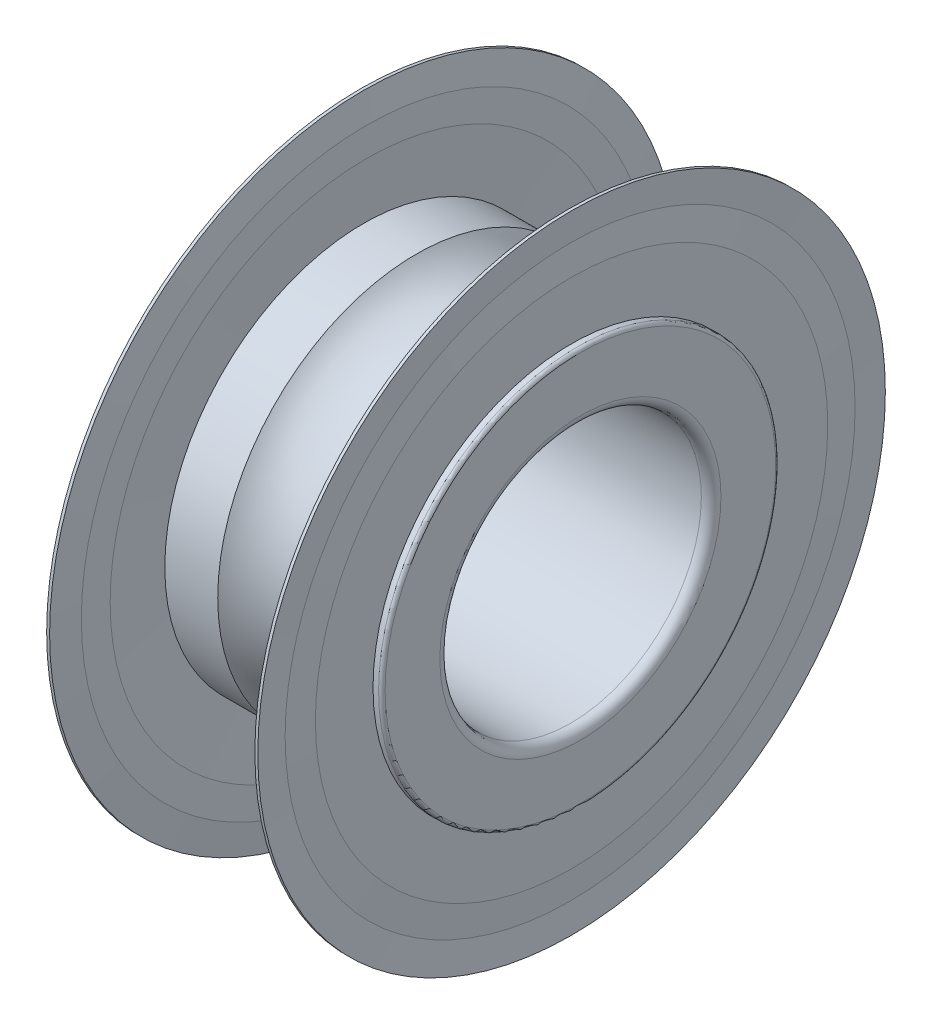
ISO-10303-21;
HEADER;
FILE_DESCRIPTION(('STEP AP214'),'2;1');
FILE_NAME('part.step','',(''),(''),'','','');
FILE_SCHEMA(('AUTOMOTIVE_DESIGN { 1 0 10303 214 1 1 1 1 }'));
ENDSEC;
DATA;
#1=APPLICATION_CONTEXT('core data for automotive mechanical design processes');
#2=APPLICATION_PROTOCOL_DEFINITION('international standard','automotive_design',2000,#1);
#3=PRODUCT_CONTEXT('',#1,'mechanical');
#4=PRODUCT('Part','Part','',(#3));
#5=PRODUCT_RELATED_PRODUCT_CATEGORY('part','',(#4));
#6=PRODUCT_DEFINITION_FORMATION('','',#4);
#7=PRODUCT_DEFINITION_CONTEXT('part definition',#1,'design');
#8=PRODUCT_DEFINITION('design','',#6,#7);
#9=PRODUCT_DEFINITION_SHAPE('','',#8);
#10=(LENGTH_UNIT() NAMED_UNIT(*) SI_UNIT(.MILLI.,.METRE.));
#11=(NAMED_UNIT(*) PLANE_ANGLE_UNIT() SI_UNIT($,.RADIAN.));
#12=(NAMED_UNIT(*) SI_UNIT($,.STERADIAN.) SOLID_ANGLE_UNIT());
#13=UNCERTAINTY_MEASURE_WITH_UNIT(LENGTH_MEASURE(1.E-05),#10,'distance_accuracy_value','');
#14=(GEOMETRIC_REPRESENTATION_CONTEXT(3) GLOBAL_UNCERTAINTY_ASSIGNED_CONTEXT((#13)) GLOBAL_UNIT_ASSIGNED_CONTEXT((#10,
#11,#12)) REPRESENTATION_CONTEXT('',''));
#15=CARTESIAN_POINT('',(0.,0.,0.));
#16=DIRECTION('',(0.,0.,1.));
#17=DIRECTION('',(1.,0.,0.));
#18=AXIS2_PLACEMENT_3D('',#15,#16,#17);
#19=CARTESIAN_POINT('',(0.,-6.13826064701138,-5.975));
#20=DIRECTION('',(-1.,0.,0.));
#21=DIRECTION('',(0.,0.,1.));
#22=AXIS2_PLACEMENT_3D('',#19,#20,#21);
#23=PLANE('',#22);
#24=CARTESIAN_POINT('',(0.,0.,0.));
#25=DIRECTION('',(-1.,0.,0.));
#26=DIRECTION('',(0.,0.,-1.));
#27=AXIS2_PLACEMENT_3D('',#24,#25,#26);
#28=CIRCLE('',#27,5.97500000788503);
#29=CARTESIAN_POINT('',(0.,0.,-5.97500000788503));
#30=VERTEX_POINT('',#29);
#31=EDGE_CURVE('E98',#30,#30,#28,.F.);
#32=ORIENTED_EDGE('',*,*,#31,.F.);
#33=EDGE_LOOP('',(#32));
#34=FACE_BOUND('',#33,.T.);
#35=CARTESIAN_POINT('',(0.,0.,0.));
#36=DIRECTION('',(1.,0.,0.));
#37=DIRECTION('',(0.,0.,1.));
#38=AXIS2_PLACEMENT_3D('',#35,#36,#37);
#39=CIRCLE('',#38,4.29999999999994);
#40=CARTESIAN_POINT('',(0.,0.,4.29999999999994));
#41=VERTEX_POINT('',#40);
#42=EDGE_CURVE('E95',#41,#41,#39,.T.);
#43=ORIENTED_EDGE('',*,*,#42,.T.);
#44=EDGE_LOOP('',(#43));
#45=FACE_BOUND('',#44,.T.);
#46=ADVANCED_FACE('F15',(#34,#45),#23,.T.);
#47=CARTESIAN_POINT('',(7.,-6.13826064701138,5.975));
#48=DIRECTION('',(1.,0.,0.));
#49=DIRECTION('',(0.,0.,-1.));
#50=AXIS2_PLACEMENT_3D('',#47,#48,#49);
#51=PLANE('',#50);
#52=CARTESIAN_POINT('',(7.,0.,0.));
#53=DIRECTION('',(1.,0.,0.));
#54=DIRECTION('',(0.,0.,1.));
#55=AXIS2_PLACEMENT_3D('',#52,#53,#54);
#56=CIRCLE('',#55,5.97500003233946);
#57=CARTESIAN_POINT('',(7.,0.,5.97500003233946));
#58=VERTEX_POINT('',#57);
#59=EDGE_CURVE('E92',#58,#58,#56,.T.);
#60=ORIENTED_EDGE('',*,*,#59,.T.);
#61=EDGE_LOOP('',(#60));
#62=FACE_BOUND('',#61,.T.);
#63=CARTESIAN_POINT('',(7.,0.,0.));
#64=DIRECTION('',(-1.,0.,0.));
#65=DIRECTION('',(0.,0.,-1.));
#66=AXIS2_PLACEMENT_3D('',#63,#64,#65);
#67=CIRCLE('',#66,4.3);
#68=CARTESIAN_POINT('',(7.,0.,-4.3));
#69=VERTEX_POINT('',#68);
#70=EDGE_CURVE('E89',#69,#69,#67,.F.);
#71=ORIENTED_EDGE('',*,*,#70,.F.);
#72=EDGE_LOOP('',(#71));
#73=FACE_BOUND('',#72,.T.);
#74=ADVANCED_FACE('F107',(#62,#73),#51,.T.);
#75=CARTESIAN_POINT('',(0.27,-8.0516515181509,-7.8375));
#76=DIRECTION('',(-1.,0.,0.));
#77=DIRECTION('',(0.,0.,1.));
#78=AXIS2_PLACEMENT_3D('',#75,#76,#77);
#79=PLANE('',#78);
#80=CARTESIAN_POINT('',(0.27,0.,0.));
#81=DIRECTION('',(-1.,0.,0.));
#82=DIRECTION('',(0.,0.,-1.));
#83=AXIS2_PLACEMENT_3D('',#80,#81,#82);
#84=CIRCLE('',#83,7.83750000000007);
#85=CARTESIAN_POINT('',(0.27,0.,-7.83750000000007));
#86=VERTEX_POINT('',#85);
#87=EDGE_CURVE('E86',#86,#86,#84,.F.);
#88=ORIENTED_EDGE('',*,*,#87,.F.);
#89=EDGE_LOOP('',(#88));
#90=FACE_BOUND('',#89,.T.);
#91=CARTESIAN_POINT('',(0.27,0.,0.));
#92=DIRECTION('',(1.,0.,0.));
#93=DIRECTION('',(0.,0.,1.));
#94=AXIS2_PLACEMENT_3D('',#91,#92,#93);
#95=CIRCLE('',#94,6.075);
#96=CARTESIAN_POINT('',(0.27,0.,6.075));
#97=VERTEX_POINT('',#96);
#98=EDGE_CURVE('E83',#97,#97,#95,.T.);
#99=ORIENTED_EDGE('',*,*,#98,.T.);
#100=EDGE_LOOP('',(#99));
#101=FACE_BOUND('',#100,.T.);
#102=ADVANCED_FACE('F204',(#90,#101),#79,.T.);
#103=CARTESIAN_POINT('',(0.45,-8.95698075583773,8.71875));
#104=DIRECTION('',(1.,0.,0.));
#105=DIRECTION('',(0.,0.,-1.));
#106=AXIS2_PLACEMENT_3D('',#103,#104,#105);
#107=PLANE('',#106);
#108=CARTESIAN_POINT('',(0.45,0.,0.));
#109=DIRECTION('',(1.,0.,0.));
#110=DIRECTION('',(0.,0.,1.));
#111=AXIS2_PLACEMENT_3D('',#108,#109,#110);
#112=CIRCLE('',#111,8.71875);
#113=CARTESIAN_POINT('',(0.45,0.,8.71875));
#114=VERTEX_POINT('',#113);
#115=EDGE_CURVE('E80',#114,#114,#112,.T.);
#116=ORIENTED_EDGE('',*,*,#115,.T.);
#117=EDGE_LOOP('',(#116));
#118=FACE_BOUND('',#117,.T.);
#119=CARTESIAN_POINT('',(0.45,0.,0.));
#120=DIRECTION('',(-1.,0.,0.));
#121=DIRECTION('',(0.,0.,-1.));
#122=AXIS2_PLACEMENT_3D('',#119,#120,#121);
#123=CIRCLE('',#122,7.8375);
#124=CARTESIAN_POINT('',(0.45,0.,-7.8375));
#125=VERTEX_POINT('',#124);
#126=EDGE_CURVE('E77',#125,#125,#123,.F.);
#127=ORIENTED_EDGE('',*,*,#126,.F.);
#128=EDGE_LOOP('',(#127));
#129=FACE_BOUND('',#128,.T.);
#130=ADVANCED_FACE('F193',(#118,#129),#107,.T.);
#131=CARTESIAN_POINT('',(6.55,-8.95698075583773,-8.71875));
#132=DIRECTION('',(-1.,0.,0.));
#133=DIRECTION('',(0.,0.,1.));
#134=AXIS2_PLACEMENT_3D('',#131,#132,#133);
#135=PLANE('',#134);
#136=CARTESIAN_POINT('',(6.55,0.,0.));
#137=DIRECTION('',(-1.,0.,0.));
#138=DIRECTION('',(0.,0.,-1.));
#139=AXIS2_PLACEMENT_3D('',#136,#137,#138);
#140=CIRCLE('',#139,8.71875000000001);
#141=CARTESIAN_POINT('',(6.55,0.,-8.71875000000001));
#142=VERTEX_POINT('',#141);
#143=EDGE_CURVE('E74',#142,#142,#140,.F.);
#144=ORIENTED_EDGE('',*,*,#143,.F.);
#145=EDGE_LOOP('',(#144));
#146=FACE_BOUND('',#145,.T.);
#147=CARTESIAN_POINT('',(6.55,0.,0.));
#148=DIRECTION('',(1.,0.,0.));
#149=DIRECTION('',(0.,-1.16849693486611E-09,1.));
#150=AXIS2_PLACEMENT_3D('',#147,#148,#149);
#151=CIRCLE('',#150,7.8375);
#152=CARTESIAN_POINT('',(6.55,-9.15809472701313E-09,7.8375));
#153=VERTEX_POINT('',#152);
#154=EDGE_CURVE('E71',#153,#153,#151,.T.);
#155=ORIENTED_EDGE('',*,*,#154,.T.);
#156=EDGE_LOOP('',(#155));
#157=FACE_BOUND('',#156,.T.);
#158=ADVANCED_FACE('F189',(#146,#157),#135,.T.);
#159=CARTESIAN_POINT('',(6.73,-8.05165150478405,7.8375));
#160=DIRECTION('',(1.,0.,0.));
#161=DIRECTION('',(0.,0.,-1.));
#162=AXIS2_PLACEMENT_3D('',#159,#160,#161);
#163=PLANE('',#162);
#164=CARTESIAN_POINT('',(6.73,0.,0.));
#165=DIRECTION('',(1.,0.,0.));
#166=DIRECTION('',(0.,-1.16849670821771E-09,1.));
#167=AXIS2_PLACEMENT_3D('',#164,#165,#166);
#168=CIRCLE('',#167,7.8375);
#169=CARTESIAN_POINT('',(6.73,-9.15809295065628E-09,7.8375));
#170=VERTEX_POINT('',#169);
#171=EDGE_CURVE('E68',#170,#170,#168,.T.);
#172=ORIENTED_EDGE('',*,*,#171,.T.);
#173=EDGE_LOOP('',(#172));
#174=FACE_BOUND('',#173,.T.);
#175=CARTESIAN_POINT('',(6.73,0.,0.));
#176=DIRECTION('',(-1.,0.,0.));
#177=DIRECTION('',(0.,0.,-1.));
#178=AXIS2_PLACEMENT_3D('',#175,#176,#177);
#179=CIRCLE('',#178,6.075);
#180=CARTESIAN_POINT('',(6.73,0.,-6.075));
#181=VERTEX_POINT('',#180);
#182=EDGE_CURVE('E65',#181,#181,#179,.F.);
#183=ORIENTED_EDGE('',*,*,#182,.F.);
#184=EDGE_LOOP('',(#183));
#185=FACE_BOUND('',#184,.T.);
#186=ADVANCED_FACE('F192',(#174,#185),#163,.T.);
#187=CARTESIAN_POINT('',(50.,0.,0.));
#188=DIRECTION('',(1.,0.,0.));
#189=DIRECTION('',(0.,0.,1.));
#190=AXIS2_PLACEMENT_3D('',#187,#188,#189);
#191=CYLINDRICAL_SURFACE('',#190,6.075);
#192=CARTESIAN_POINT('',(5.020728526069,0.,0.));
#193=DIRECTION('',(1.,0.,0.));
#194=DIRECTION('',(0.,0.,1.));
#195=AXIS2_PLACEMENT_3D('',#192,#193,#194);
#196=CIRCLE('',#195,6.075);
#197=CARTESIAN_POINT('',(5.020728526069,0.,6.075));
#198=VERTEX_POINT('',#197);
#199=EDGE_CURVE('E62',#198,#198,#196,.T.);
#200=ORIENTED_EDGE('',*,*,#199,.T.);
#201=EDGE_LOOP('',(#200));
#202=FACE_BOUND('',#201,.T.);
#203=CARTESIAN_POINT('',(6.64,0.,0.));
#204=DIRECTION('',(-1.,0.,0.));
#205=DIRECTION('',(0.,0.,-1.));
#206=AXIS2_PLACEMENT_3D('',#203,#204,#205);
#207=CIRCLE('',#206,6.075);
#208=CARTESIAN_POINT('',(6.64,0.,-6.075));
#209=VERTEX_POINT('',#208);
#210=EDGE_CURVE('E59',#209,#209,#207,.F.);
#211=ORIENTED_EDGE('',*,*,#210,.F.);
#212=EDGE_LOOP('',(#211));
#213=FACE_BOUND('',#212,.T.);
#214=ADVANCED_FACE('F201',(#202,#213),#191,.T.);
#215=CARTESIAN_POINT('',(50.,0.,0.));
#216=DIRECTION('',(1.,0.,0.));
#217=DIRECTION('',(0.,0.,1.));
#218=AXIS2_PLACEMENT_3D('',#215,#216,#217);
#219=CYLINDRICAL_SURFACE('',#218,6.075);
#220=CARTESIAN_POINT('',(0.100000000000001,0.,0.));
#221=DIRECTION('',(1.,0.,0.));
#222=DIRECTION('',(0.,0.,1.));
#223=AXIS2_PLACEMENT_3D('',#220,#221,#222);
#224=CIRCLE('',#223,6.075);
#225=CARTESIAN_POINT('',(0.100000000000001,0.,6.075));
#226=VERTEX_POINT('',#225);
#227=EDGE_CURVE('E56',#226,#226,#224,.T.);
#228=ORIENTED_EDGE('',*,*,#227,.T.);
#229=EDGE_LOOP('',(#228));
#230=FACE_BOUND('',#229,.T.);
#231=ORIENTED_EDGE('',*,*,#98,.F.);
#232=EDGE_LOOP('',(#231));
#233=FACE_BOUND('',#232,.T.);
#234=ADVANCED_FACE('F124',(#230,#233),#219,.T.);
#235=CARTESIAN_POINT('',(0.0999999999999228,0.,0.));
#236=DIRECTION('',(1.,0.,0.));
#237=DIRECTION('',(0.,0.,1.));
#238=AXIS2_PLACEMENT_3D('',#235,#236,#237);
#239=TOROIDAL_SURFACE('',#238,5.97500000000008,0.0999999999999231);
#240=ORIENTED_EDGE('',*,*,#31,.T.);
#241=EDGE_LOOP('',(#240));
#242=FACE_BOUND('',#241,.T.);
#243=ORIENTED_EDGE('',*,*,#227,.F.);
#244=EDGE_LOOP('',(#243));
#245=FACE_BOUND('',#244,.T.);
#246=ADVANCED_FACE('F102',(#242,#245),#239,.T.);
#247=CARTESIAN_POINT('',(0.299999999999938,0.,0.));
#248=DIRECTION('',(1.,0.,0.));
#249=DIRECTION('',(0.,0.,1.));
#250=AXIS2_PLACEMENT_3D('',#247,#248,#249);
#251=TOROIDAL_SURFACE('',#250,4.29999999999994,0.299999999999938);
#252=CARTESIAN_POINT('',(0.3,0.,0.));
#253=DIRECTION('',(1.,0.,0.));
#254=DIRECTION('',(0.,0.,1.));
#255=AXIS2_PLACEMENT_3D('',#252,#253,#254);
#256=CIRCLE('',#255,4.);
#257=CARTESIAN_POINT('',(0.3,0.,4.));
#258=VERTEX_POINT('',#257);
#259=EDGE_CURVE('E53',#258,#258,#256,.T.);
#260=ORIENTED_EDGE('',*,*,#259,.T.);
#261=EDGE_LOOP('',(#260));
#262=FACE_BOUND('',#261,.T.);
#263=ORIENTED_EDGE('',*,*,#42,.F.);
#264=EDGE_LOOP('',(#263));
#265=FACE_BOUND('',#264,.T.);
#266=ADVANCED_FACE('F111',(#262,#265),#251,.T.);
#267=CARTESIAN_POINT('',(50.,0.,0.));
#268=DIRECTION('',(1.,0.,0.));
#269=DIRECTION('',(0.,0.,1.));
#270=AXIS2_PLACEMENT_3D('',#267,#268,#269);
#271=CYLINDRICAL_SURFACE('',#270,4.);
#272=CARTESIAN_POINT('',(6.7,0.,0.));
#273=DIRECTION('',(1.,0.,0.));
#274=DIRECTION('',(0.,0.,1.));
#275=AXIS2_PLACEMENT_3D('',#272,#273,#274);
#276=CIRCLE('',#275,4.);
#277=CARTESIAN_POINT('',(6.7,0.,4.));
#278=VERTEX_POINT('',#277);
#279=EDGE_CURVE('E50',#278,#278,#276,.T.);
#280=ORIENTED_EDGE('',*,*,#279,.T.);
#281=EDGE_LOOP('',(#280));
#282=FACE_BOUND('',#281,.T.);
#283=ORIENTED_EDGE('',*,*,#259,.F.);
#284=EDGE_LOOP('',(#283));
#285=FACE_BOUND('',#284,.T.);
#286=ADVANCED_FACE('F113',(#282,#285),#271,.F.);
#287=CARTESIAN_POINT('',(6.70000000000012,0.,0.));
#288=DIRECTION('',(1.,0.,0.));
#289=DIRECTION('',(0.,0.,1.));
#290=AXIS2_PLACEMENT_3D('',#287,#288,#289);
#291=TOROIDAL_SURFACE('',#290,4.29999999999988,0.299999999999877);
#292=ORIENTED_EDGE('',*,*,#70,.T.);
#293=EDGE_LOOP('',(#292));
#294=FACE_BOUND('',#293,.T.);
#295=ORIENTED_EDGE('',*,*,#279,.F.);
#296=EDGE_LOOP('',(#295));
#297=FACE_BOUND('',#296,.T.);
#298=ADVANCED_FACE('F121',(#294,#297),#291,.T.);
#299=CARTESIAN_POINT('',(6.90000000000016,0.,0.));
#300=DIRECTION('',(1.,0.,0.));
#301=DIRECTION('',(0.,0.,1.));
#302=AXIS2_PLACEMENT_3D('',#299,#300,#301);
#303=TOROIDAL_SURFACE('',#302,5.97500000000016,0.099999999999845);
#304=CARTESIAN_POINT('',(6.90000000000016,0.,0.));
#305=DIRECTION('',(1.,0.,0.));
#306=DIRECTION('',(0.,0.,1.));
#307=AXIS2_PLACEMENT_3D('',#304,#305,#306);
#308=CIRCLE('',#307,6.075);
#309=CARTESIAN_POINT('',(6.90000000000016,0.,6.075));
#310=VERTEX_POINT('',#309);
#311=EDGE_CURVE('E47',#310,#310,#308,.T.);
#312=ORIENTED_EDGE('',*,*,#311,.T.);
#313=EDGE_LOOP('',(#312));
#314=FACE_BOUND('',#313,.T.);
#315=ORIENTED_EDGE('',*,*,#59,.F.);
#316=EDGE_LOOP('',(#315));
#317=FACE_BOUND('',#316,.T.);
#318=ADVANCED_FACE('F130',(#314,#317),#303,.T.);
#319=CARTESIAN_POINT('',(50.,0.,0.));
#320=DIRECTION('',(1.,0.,0.));
#321=DIRECTION('',(0.,1.16843036391409E-09,1.));
#322=AXIS2_PLACEMENT_3D('',#319,#320,#321);
#323=CYLINDRICAL_SURFACE('',#322,6.075);
#324=ORIENTED_EDGE('',*,*,#182,.T.);
#325=EDGE_LOOP('',(#324));
#326=FACE_BOUND('',#325,.T.);
#327=ORIENTED_EDGE('',*,*,#311,.F.);
#328=EDGE_LOOP('',(#327));
#329=FACE_BOUND('',#328,.T.);
#330=ADVANCED_FACE('F134',(#326,#329),#323,.T.);
#331=CARTESIAN_POINT('',(3.5,0.,0.));
#332=DIRECTION('',(1.,0.,0.));
#333=DIRECTION('',(0.,0.,1.));
#334=AXIS2_PLACEMENT_3D('',#331,#332,#333);
#335=TOROIDAL_SURFACE('',#334,7.35,1.9845);
#336=ORIENTED_EDGE('',*,*,#199,.F.);
#337=EDGE_LOOP('',(#336));
#338=FACE_BOUND('',#337,.T.);
#339=CARTESIAN_POINT('',(1.979271473931,0.,0.));
#340=DIRECTION('',(1.,0.,0.));
#341=DIRECTION('',(0.,0.,1.));
#342=AXIS2_PLACEMENT_3D('',#339,#340,#341);
#343=CIRCLE('',#342,6.075);
#344=CARTESIAN_POINT('',(1.979271473931,0.,6.075));
#345=VERTEX_POINT('',#344);
#346=EDGE_CURVE('E44',#345,#345,#343,.T.);
#347=ORIENTED_EDGE('',*,*,#346,.T.);
#348=EDGE_LOOP('',(#347));
#349=FACE_BOUND('',#348,.T.);
#350=ADVANCED_FACE('F138',(#338,#349),#335,.F.);
#351=CARTESIAN_POINT('',(50.,0.,0.));
#352=DIRECTION('',(1.,0.,0.));
#353=DIRECTION('',(0.,0.,1.));
#354=AXIS2_PLACEMENT_3D('',#351,#352,#353);
#355=CYLINDRICAL_SURFACE('',#354,6.075);
#356=CARTESIAN_POINT('',(0.359999999999999,0.,0.));
#357=DIRECTION('',(1.,0.,0.));
#358=DIRECTION('',(0.,0.,1.));
#359=AXIS2_PLACEMENT_3D('',#356,#357,#358);
#360=CIRCLE('',#359,6.075);
#361=CARTESIAN_POINT('',(0.359999999999999,0.,6.075));
#362=VERTEX_POINT('',#361);
#363=EDGE_CURVE('E41',#362,#362,#360,.T.);
#364=ORIENTED_EDGE('',*,*,#363,.T.);
#365=EDGE_LOOP('',(#364));
#366=FACE_BOUND('',#365,.T.);
#367=ORIENTED_EDGE('',*,*,#346,.F.);
#368=EDGE_LOOP('',(#367));
#369=FACE_BOUND('',#368,.T.);
#370=ADVANCED_FACE('F142',(#366,#369),#355,.T.);
#371=CARTESIAN_POINT('',(50.,0.,0.));
#372=DIRECTION('',(1.,0.,0.));
#373=DIRECTION('',(0.,0.,1.));
#374=AXIS2_PLACEMENT_3D('',#371,#372,#373);
#375=CYLINDRICAL_SURFACE('',#374,9.6);
#376=CARTESIAN_POINT('',(0.270000000000003,0.,0.));
#377=DIRECTION('',(1.,0.,0.));
#378=DIRECTION('',(0.,0.,1.));
#379=AXIS2_PLACEMENT_3D('',#376,#377,#378);
#380=CIRCLE('',#379,9.6);
#381=CARTESIAN_POINT('',(0.270000000000003,0.,9.6));
#382=VERTEX_POINT('',#381);
#383=EDGE_CURVE('E38',#382,#382,#380,.T.);
#384=ORIENTED_EDGE('',*,*,#383,.T.);
#385=EDGE_LOOP('',(#384));
#386=FACE_BOUND('',#385,.T.);
#387=CARTESIAN_POINT('',(0.359999999999999,0.,0.));
#388=DIRECTION('',(-1.,0.,0.));
#389=DIRECTION('',(0.,0.,-1.));
#390=AXIS2_PLACEMENT_3D('',#387,#388,#389);
#391=CIRCLE('',#390,9.6);
#392=CARTESIAN_POINT('',(0.359999999999999,0.,-9.6));
#393=VERTEX_POINT('',#392);
#394=EDGE_CURVE('E35',#393,#393,#391,.F.);
#395=ORIENTED_EDGE('',*,*,#394,.F.);
#396=EDGE_LOOP('',(#395));
#397=FACE_BOUND('',#396,.T.);
#398=ADVANCED_FACE('F146',(#386,#397),#375,.T.);
#399=CARTESIAN_POINT('',(0.27,0.,0.));
#400=DIRECTION('',(-1.,0.,0.));
#401=DIRECTION('',(0.,0.,-1.));
#402=AXIS2_PLACEMENT_3D('',#399,#400,#401);
#403=CONICAL_SURFACE('',#402,9.6,1.51977681092792);
#404=ORIENTED_EDGE('',*,*,#383,.F.);
#405=EDGE_LOOP('',(#404));
#406=FACE_BOUND('',#405,.T.);
#407=CARTESIAN_POINT('',(0.315000000000003,0.,0.));
#408=DIRECTION('',(1.,0.,0.));
#409=DIRECTION('',(0.,0.,1.));
#410=AXIS2_PLACEMENT_3D('',#407,#408,#409);
#411=CIRCLE('',#410,8.71875);
#412=CARTESIAN_POINT('',(0.315000000000003,0.,8.71875));
#413=VERTEX_POINT('',#412);
#414=EDGE_CURVE('E30',#413,#413,#411,.T.);
#415=ORIENTED_EDGE('',*,*,#414,.T.);
#416=EDGE_LOOP('',(#415));
#417=FACE_BOUND('',#416,.T.);
#418=ADVANCED_FACE('F150',(#406,#417),#403,.F.);
#419=CARTESIAN_POINT('',(0.315,0.,0.));
#420=DIRECTION('',(1.,0.,0.));
#421=DIRECTION('',(0.,0.,1.));
#422=AXIS2_PLACEMENT_3D('',#419,#420,#421);
#423=CONICAL_SURFACE('',#422,8.71875,1.51977681092792);
#424=ORIENTED_EDGE('',*,*,#87,.T.);
#425=EDGE_LOOP('',(#424));
#426=FACE_BOUND('',#425,.T.);
#427=ORIENTED_EDGE('',*,*,#414,.F.);
#428=EDGE_LOOP('',(#427));
#429=FACE_BOUND('',#428,.T.);
#430=ADVANCED_FACE('F154',(#426,#429),#423,.T.);
#431=CARTESIAN_POINT('',(0.45,0.,0.));
#432=DIRECTION('',(1.,0.,0.));
#433=DIRECTION('',(0.,0.,1.));
#434=AXIS2_PLACEMENT_3D('',#431,#432,#433);
#435=CONICAL_SURFACE('',#434,7.8375,1.51977681092793);
#436=ORIENTED_EDGE('',*,*,#126,.T.);
#437=EDGE_LOOP('',(#436));
#438=FACE_BOUND('',#437,.T.);
#439=ORIENTED_EDGE('',*,*,#363,.F.);
#440=EDGE_LOOP('',(#439));
#441=FACE_BOUND('',#440,.T.);
#442=ADVANCED_FACE('F158',(#438,#441),#435,.F.);
#443=CARTESIAN_POINT('',(0.359999999999999,0.,0.));
#444=DIRECTION('',(-1.,0.,0.));
#445=DIRECTION('',(0.,0.,-1.));
#446=AXIS2_PLACEMENT_3D('',#443,#444,#445);
#447=CONICAL_SURFACE('',#446,9.6,1.46902152746005);
#448=ORIENTED_EDGE('',*,*,#394,.T.);
#449=EDGE_LOOP('',(#448));
#450=FACE_BOUND('',#449,.T.);
#451=ORIENTED_EDGE('',*,*,#115,.F.);
#452=EDGE_LOOP('',(#451));
#453=FACE_BOUND('',#452,.T.);
#454=ADVANCED_FACE('F162',(#450,#453),#447,.T.);
#455=CARTESIAN_POINT('',(6.55,0.,0.));
#456=DIRECTION('',(-1.,0.,0.));
#457=DIRECTION('',(0.,0.,-1.));
#458=AXIS2_PLACEMENT_3D('',#455,#456,#457);
#459=CONICAL_SURFACE('',#458,7.8375,1.51977681092793);
#460=ORIENTED_EDGE('',*,*,#210,.T.);
#461=EDGE_LOOP('',(#460));
#462=FACE_BOUND('',#461,.T.);
#463=ORIENTED_EDGE('',*,*,#154,.F.);
#464=EDGE_LOOP('',(#463));
#465=FACE_BOUND('',#464,.T.);
#466=ADVANCED_FACE('F166',(#462,#465),#459,.F.);
#467=CARTESIAN_POINT('',(6.685,0.,0.));
#468=DIRECTION('',(-1.,0.,0.));
#469=DIRECTION('',(0.,0.,-1.));
#470=AXIS2_PLACEMENT_3D('',#467,#468,#469);
#471=CONICAL_SURFACE('',#470,8.71875,1.51977681092792);
#472=ORIENTED_EDGE('',*,*,#171,.F.);
#473=EDGE_LOOP('',(#472));
#474=FACE_BOUND('',#473,.T.);
#475=CARTESIAN_POINT('',(6.685,0.,0.));
#476=DIRECTION('',(1.,0.,0.));
#477=DIRECTION('',(0.,0.,1.));
#478=AXIS2_PLACEMENT_3D('',#475,#476,#477);
#479=CIRCLE('',#478,8.71875);
#480=CARTESIAN_POINT('',(6.685,0.,8.71875));
#481=VERTEX_POINT('',#480);
#482=EDGE_CURVE('E26',#481,#481,#479,.T.);
#483=ORIENTED_EDGE('',*,*,#482,.T.);
#484=EDGE_LOOP('',(#483));
#485=FACE_BOUND('',#484,.T.);
#486=ADVANCED_FACE('F170',(#474,#485),#471,.T.);
#487=CARTESIAN_POINT('',(6.73,0.,0.));
#488=DIRECTION('',(1.,0.,0.));
#489=DIRECTION('',(0.,0.,1.));
#490=AXIS2_PLACEMENT_3D('',#487,#488,#489);
#491=CONICAL_SURFACE('',#490,9.6,1.51977681092792);
#492=CARTESIAN_POINT('',(6.73,0.,0.));
#493=DIRECTION('',(1.,0.,0.));
#494=DIRECTION('',(0.,0.,1.));
#495=AXIS2_PLACEMENT_3D('',#492,#493,#494);
#496=CIRCLE('',#495,9.6);
#497=CARTESIAN_POINT('',(6.73,0.,9.6));
#498=VERTEX_POINT('',#497);
#499=EDGE_CURVE('E22',#498,#498,#496,.T.);
#500=ORIENTED_EDGE('',*,*,#499,.T.);
#501=EDGE_LOOP('',(#500));
#502=FACE_BOUND('',#501,.T.);
#503=ORIENTED_EDGE('',*,*,#482,.F.);
#504=EDGE_LOOP('',(#503));
#505=FACE_BOUND('',#504,.T.);
#506=ADVANCED_FACE('F174',(#502,#505),#491,.F.);
#507=CARTESIAN_POINT('',(50.,0.,0.));
#508=DIRECTION('',(1.,0.,0.));
#509=DIRECTION('',(0.,0.,1.));
#510=AXIS2_PLACEMENT_3D('',#507,#508,#509);
#511=CYLINDRICAL_SURFACE('',#510,9.6);
#512=CARTESIAN_POINT('',(6.64,0.,0.));
#513=DIRECTION('',(1.,0.,0.));
#514=DIRECTION('',(0.,0.,1.));
#515=AXIS2_PLACEMENT_3D('',#512,#513,#514);
#516=CIRCLE('',#515,9.6);
#517=CARTESIAN_POINT('',(6.64,0.,9.6));
#518=VERTEX_POINT('',#517);
#519=EDGE_CURVE('E10',#518,#518,#516,.T.);
#520=ORIENTED_EDGE('',*,*,#519,.T.);
#521=EDGE_LOOP('',(#520));
#522=FACE_BOUND('',#521,.T.);
#523=ORIENTED_EDGE('',*,*,#499,.F.);
#524=EDGE_LOOP('',(#523));
#525=FACE_BOUND('',#524,.T.);
#526=ADVANCED_FACE('F177',(#522,#525),#511,.T.);
#527=CARTESIAN_POINT('',(6.64,0.,0.));
#528=DIRECTION('',(1.,0.,0.));
#529=DIRECTION('',(0.,0.,1.));
#530=AXIS2_PLACEMENT_3D('',#527,#528,#529);
#531=CONICAL_SURFACE('',#530,9.6,1.46902152746005);
#532=ORIENTED_EDGE('',*,*,#143,.T.);
#533=EDGE_LOOP('',(#532));
#534=FACE_BOUND('',#533,.T.);
#535=ORIENTED_EDGE('',*,*,#519,.F.);
#536=EDGE_LOOP('',(#535));
#537=FACE_BOUND('',#536,.T.);
#538=ADVANCED_FACE('F17',(#534,#537),#531,.T.);
#539=CLOSED_SHELL('',(#46,#74,#102,#130,#158,#186,#214,#234,#246,#266,#286,#298,#318,#330,#350,
#370,#398,#418,#430,#442,#454,#466,#486,#506,#526,#538));
#540=MANIFOLD_SOLID_BREP('B1',#539);
#541=ADVANCED_BREP_SHAPE_REPRESENTATION('',(#18,#540),#14);
#542=SHAPE_DEFINITION_REPRESENTATION(#9,#541);
ENDSEC;
END-ISO-10303-21;
